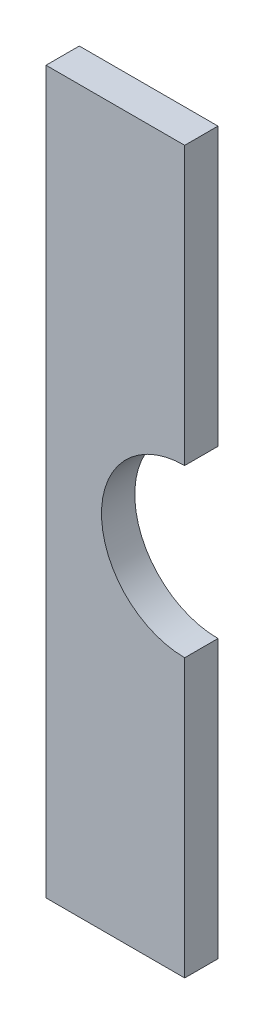
ISO-10303-21;
HEADER;
FILE_DESCRIPTION(('STEP AP214'),'2;1');
FILE_NAME('part.step','',(''),(''),'','','');
FILE_SCHEMA(('AUTOMOTIVE_DESIGN { 1 0 10303 214 1 1 1 1 }'));
ENDSEC;
DATA;
#1=APPLICATION_CONTEXT('core data for automotive mechanical design processes');
#2=APPLICATION_PROTOCOL_DEFINITION('international standard','automotive_design',2000,#1);
#3=PRODUCT_CONTEXT('',#1,'mechanical');
#4=PRODUCT('Part','Part','',(#3));
#5=PRODUCT_RELATED_PRODUCT_CATEGORY('part','',(#4));
#6=PRODUCT_DEFINITION_FORMATION('','',#4);
#7=PRODUCT_DEFINITION_CONTEXT('part definition',#1,'design');
#8=PRODUCT_DEFINITION('design','',#6,#7);
#9=PRODUCT_DEFINITION_SHAPE('','',#8);
#10=(LENGTH_UNIT() NAMED_UNIT(*) SI_UNIT(.MILLI.,.METRE.));
#11=(NAMED_UNIT(*) PLANE_ANGLE_UNIT() SI_UNIT($,.RADIAN.));
#12=(NAMED_UNIT(*) SI_UNIT($,.STERADIAN.) SOLID_ANGLE_UNIT());
#13=UNCERTAINTY_MEASURE_WITH_UNIT(LENGTH_MEASURE(1.E-05),#10,'distance_accuracy_value','');
#14=(GEOMETRIC_REPRESENTATION_CONTEXT(3) GLOBAL_UNCERTAINTY_ASSIGNED_CONTEXT((#13)) GLOBAL_UNIT_ASSIGNED_CONTEXT((#10,
#11,#12)) REPRESENTATION_CONTEXT('',''));
#15=CARTESIAN_POINT('',(0.,0.,0.));
#16=DIRECTION('',(0.,0.,1.));
#17=DIRECTION('',(1.,0.,0.));
#18=AXIS2_PLACEMENT_3D('',#15,#16,#17);
#19=CARTESIAN_POINT('',(1.75,0.,0.));
#20=DIRECTION('',(0.,0.,1.));
#21=DIRECTION('',(-1.,0.,0.));
#22=AXIS2_PLACEMENT_3D('',#19,#20,#21);
#23=CYLINDRICAL_SURFACE('',#22,0.15);
#24=CARTESIAN_POINT('',(1.75,0.,0.06));
#25=DIRECTION('',(0.,0.,-1.));
#26=DIRECTION('',(-1.,0.,0.));
#27=AXIS2_PLACEMENT_3D('',#24,#25,#26);
#28=CIRCLE('',#27,0.15);
#29=CARTESIAN_POINT('',(1.75,-0.15,0.06));
#30=VERTEX_POINT('',#29);
#31=CARTESIAN_POINT('',(1.75,0.15,0.06));
#32=VERTEX_POINT('',#31);
#33=EDGE_CURVE('E11',#30,#32,#28,.T.);
#34=ORIENTED_EDGE('',*,*,#33,.T.);
#35=DIRECTION('',(0.,0.,1.));
#36=VECTOR('',#35,1.);
#37=CARTESIAN_POINT('',(1.75,0.15,0.));
#38=LINE('',#37,#36);
#39=CARTESIAN_POINT('',(1.75,0.15,0.12));
#40=VERTEX_POINT('',#39);
#41=EDGE_CURVE('E24',#32,#40,#38,.T.);
#42=ORIENTED_EDGE('',*,*,#41,.T.);
#43=CARTESIAN_POINT('',(1.75,0.,0.12));
#44=DIRECTION('',(0.,0.,-1.));
#45=DIRECTION('',(-1.,0.,0.));
#46=AXIS2_PLACEMENT_3D('',#43,#44,#45);
#47=CIRCLE('',#46,0.15);
#48=CARTESIAN_POINT('',(1.75,-0.15,0.12));
#49=VERTEX_POINT('',#48);
#50=EDGE_CURVE('E89',#49,#40,#47,.T.);
#51=ORIENTED_EDGE('',*,*,#50,.F.);
#52=DIRECTION('',(0.,0.,1.));
#53=VECTOR('',#52,1.);
#54=CARTESIAN_POINT('',(1.75,-0.15,0.));
#55=LINE('',#54,#53);
#56=EDGE_CURVE('E36',#30,#49,#55,.T.);
#57=ORIENTED_EDGE('',*,*,#56,.F.);
#58=EDGE_LOOP('',(#34,#42,#51,#57));
#59=FACE_BOUND('',#58,.T.);
#60=ADVANCED_FACE('F17',(#59),#23,.F.);
#61=CARTESIAN_POINT('',(1.75,-0.65,0.));
#62=DIRECTION('',(1.,0.,0.));
#63=DIRECTION('',(0.,1.,0.));
#64=AXIS2_PLACEMENT_3D('',#61,#62,#63);
#65=PLANE('',#64);
#66=DIRECTION('',(0.,1.,0.));
#67=VECTOR('',#66,1.);
#68=CARTESIAN_POINT('',(1.75,-0.325,0.06));
#69=LINE('',#68,#67);
#70=CARTESIAN_POINT('',(1.75,-0.65,0.06));
#71=VERTEX_POINT('',#70);
#72=EDGE_CURVE('E114',#71,#30,#69,.T.);
#73=ORIENTED_EDGE('',*,*,#72,.T.);
#74=ORIENTED_EDGE('',*,*,#56,.T.);
#75=DIRECTION('',(0.,1.,0.));
#76=VECTOR('',#75,1.);
#77=CARTESIAN_POINT('',(1.75,-0.65,0.12));
#78=LINE('',#77,#76);
#79=CARTESIAN_POINT('',(1.75,-0.65,0.12));
#80=VERTEX_POINT('',#79);
#81=EDGE_CURVE('E112',#80,#49,#78,.T.);
#82=ORIENTED_EDGE('',*,*,#81,.F.);
#83=DIRECTION('',(0.,0.,1.));
#84=VECTOR('',#83,1.);
#85=CARTESIAN_POINT('',(1.75,-0.65,0.));
#86=LINE('',#85,#84);
#87=EDGE_CURVE('E109',#71,#80,#86,.T.);
#88=ORIENTED_EDGE('',*,*,#87,.F.);
#89=EDGE_LOOP('',(#73,#74,#82,#88));
#90=FACE_BOUND('',#89,.T.);
#91=ADVANCED_FACE('F127',(#90),#65,.T.);
#92=CARTESIAN_POINT('',(1.5,-0.65,0.));
#93=DIRECTION('',(0.,-1.,0.));
#94=DIRECTION('',(1.,0.,0.));
#95=AXIS2_PLACEMENT_3D('',#92,#93,#94);
#96=PLANE('',#95);
#97=DIRECTION('',(1.,0.,0.));
#98=VECTOR('',#97,1.);
#99=CARTESIAN_POINT('',(1.5625,-0.65,0.06));
#100=LINE('',#99,#98);
#101=CARTESIAN_POINT('',(1.5,-0.65,0.06));
#102=VERTEX_POINT('',#101);
#103=EDGE_CURVE('E106',#102,#71,#100,.T.);
#104=ORIENTED_EDGE('',*,*,#103,.T.);
#105=ORIENTED_EDGE('',*,*,#87,.T.);
#106=DIRECTION('',(1.,0.,0.));
#107=VECTOR('',#106,1.);
#108=CARTESIAN_POINT('',(-1.75,-0.65,0.12));
#109=LINE('',#108,#107);
#110=CARTESIAN_POINT('',(1.5,-0.65,0.12));
#111=VERTEX_POINT('',#110);
#112=EDGE_CURVE('E103',#111,#80,#109,.T.);
#113=ORIENTED_EDGE('',*,*,#112,.F.);
#114=DIRECTION('',(0.,0.,1.));
#115=VECTOR('',#114,1.);
#116=CARTESIAN_POINT('',(1.5,-0.65,0.));
#117=LINE('',#116,#115);
#118=EDGE_CURVE('E100',#102,#111,#117,.T.);
#119=ORIENTED_EDGE('',*,*,#118,.F.);
#120=EDGE_LOOP('',(#104,#105,#113,#119));
#121=FACE_BOUND('',#120,.T.);
#122=ADVANCED_FACE('F124',(#121),#96,.T.);
#123=CARTESIAN_POINT('',(1.5,0.65,0.));
#124=DIRECTION('',(-1.,0.,0.));
#125=DIRECTION('',(0.,-1.,0.));
#126=AXIS2_PLACEMENT_3D('',#123,#124,#125);
#127=PLANE('',#126);
#128=DIRECTION('',(0.,-1.,0.));
#129=VECTOR('',#128,1.);
#130=CARTESIAN_POINT('',(1.5,0.325,0.06));
#131=LINE('',#130,#129);
#132=CARTESIAN_POINT('',(1.5,0.65,0.06));
#133=VERTEX_POINT('',#132);
#134=EDGE_CURVE('E97',#133,#102,#131,.T.);
#135=ORIENTED_EDGE('',*,*,#134,.T.);
#136=ORIENTED_EDGE('',*,*,#118,.T.);
#137=DIRECTION('',(0.,-1.,0.));
#138=VECTOR('',#137,1.);
#139=CARTESIAN_POINT('',(1.5,0.65,0.12));
#140=LINE('',#139,#138);
#141=CARTESIAN_POINT('',(1.5,0.65,0.12));
#142=VERTEX_POINT('',#141);
#143=EDGE_CURVE('E95',#142,#111,#140,.T.);
#144=ORIENTED_EDGE('',*,*,#143,.F.);
#145=DIRECTION('',(0.,0.,1.));
#146=VECTOR('',#145,1.);
#147=CARTESIAN_POINT('',(1.5,0.65,0.));
#148=LINE('',#147,#146);
#149=EDGE_CURVE('E76',#133,#142,#148,.T.);
#150=ORIENTED_EDGE('',*,*,#149,.F.);
#151=EDGE_LOOP('',(#135,#136,#144,#150));
#152=FACE_BOUND('',#151,.T.);
#153=ADVANCED_FACE('F122',(#152),#127,.T.);
#154=CARTESIAN_POINT('',(1.75,0.65,0.));
#155=DIRECTION('',(0.,1.,0.));
#156=DIRECTION('',(-1.,0.,0.));
#157=AXIS2_PLACEMENT_3D('',#154,#155,#156);
#158=PLANE('',#157);
#159=DIRECTION('',(-1.,0.,0.));
#160=VECTOR('',#159,1.);
#161=CARTESIAN_POINT('',(1.6875,0.65,0.06));
#162=LINE('',#161,#160);
#163=CARTESIAN_POINT('',(1.75,0.65,0.06));
#164=VERTEX_POINT('',#163);
#165=EDGE_CURVE('E80',#164,#133,#162,.T.);
#166=ORIENTED_EDGE('',*,*,#165,.T.);
#167=ORIENTED_EDGE('',*,*,#149,.T.);
#168=DIRECTION('',(-1.,0.,0.));
#169=VECTOR('',#168,1.);
#170=CARTESIAN_POINT('',(1.75,0.65,0.12));
#171=LINE('',#170,#169);
#172=CARTESIAN_POINT('',(1.75,0.65,0.12));
#173=VERTEX_POINT('',#172);
#174=EDGE_CURVE('E70',#173,#142,#171,.T.);
#175=ORIENTED_EDGE('',*,*,#174,.F.);
#176=DIRECTION('',(0.,0.,1.));
#177=VECTOR('',#176,1.);
#178=CARTESIAN_POINT('',(1.75,0.65,0.));
#179=LINE('',#178,#177);
#180=EDGE_CURVE('E74',#164,#173,#179,.T.);
#181=ORIENTED_EDGE('',*,*,#180,.F.);
#182=EDGE_LOOP('',(#166,#167,#175,#181));
#183=FACE_BOUND('',#182,.T.);
#184=ADVANCED_FACE('F73',(#183),#158,.T.);
#185=CARTESIAN_POINT('',(1.75,0.15,0.));
#186=DIRECTION('',(1.,0.,0.));
#187=DIRECTION('',(0.,1.,0.));
#188=AXIS2_PLACEMENT_3D('',#185,#186,#187);
#189=PLANE('',#188);
#190=DIRECTION('',(0.,1.,0.));
#191=VECTOR('',#190,1.);
#192=CARTESIAN_POINT('',(1.75,0.075,0.06));
#193=LINE('',#192,#191);
#194=EDGE_CURVE('E85',#32,#164,#193,.T.);
#195=ORIENTED_EDGE('',*,*,#194,.T.);
#196=ORIENTED_EDGE('',*,*,#180,.T.);
#197=DIRECTION('',(0.,1.,0.));
#198=VECTOR('',#197,1.);
#199=CARTESIAN_POINT('',(1.75,-0.65,0.12));
#200=LINE('',#199,#198);
#201=EDGE_CURVE('E83',#40,#173,#200,.T.);
#202=ORIENTED_EDGE('',*,*,#201,.F.);
#203=ORIENTED_EDGE('',*,*,#41,.F.);
#204=EDGE_LOOP('',(#195,#196,#202,#203));
#205=FACE_BOUND('',#204,.T.);
#206=ADVANCED_FACE('F82',(#205),#189,.T.);
#207=CARTESIAN_POINT('',(1.625,0.,0.12));
#208=DIRECTION('',(0.,0.,1.));
#209=DIRECTION('',(1.,0.,0.));
#210=AXIS2_PLACEMENT_3D('',#207,#208,#209);
#211=PLANE('',#210);
#212=ORIENTED_EDGE('',*,*,#201,.T.);
#213=ORIENTED_EDGE('',*,*,#174,.T.);
#214=ORIENTED_EDGE('',*,*,#143,.T.);
#215=ORIENTED_EDGE('',*,*,#112,.T.);
#216=ORIENTED_EDGE('',*,*,#81,.T.);
#217=ORIENTED_EDGE('',*,*,#50,.T.);
#218=EDGE_LOOP('',(#212,#213,#214,#215,#216,#217));
#219=FACE_BOUND('',#218,.T.);
#220=ADVANCED_FACE('F87',(#219),#211,.T.);
#221=CARTESIAN_POINT('',(1.625,0.,0.06));
#222=DIRECTION('',(0.,0.,1.));
#223=DIRECTION('',(1.,0.,0.));
#224=AXIS2_PLACEMENT_3D('',#221,#222,#223);
#225=PLANE('',#224);
#226=ORIENTED_EDGE('',*,*,#194,.F.);
#227=ORIENTED_EDGE('',*,*,#33,.F.);
#228=ORIENTED_EDGE('',*,*,#72,.F.);
#229=ORIENTED_EDGE('',*,*,#103,.F.);
#230=ORIENTED_EDGE('',*,*,#134,.F.);
#231=ORIENTED_EDGE('',*,*,#165,.F.);
#232=EDGE_LOOP('',(#226,#227,#228,#229,#230,#231));
#233=FACE_BOUND('',#232,.T.);
#234=ADVANCED_FACE('F119',(#233),#225,.F.);
#235=CLOSED_SHELL('',(#60,#91,#122,#153,#184,#206,#220,#234));
#236=MANIFOLD_SOLID_BREP('B1',#235);
#237=ADVANCED_BREP_SHAPE_REPRESENTATION('',(#18,#236),#14);
#238=SHAPE_DEFINITION_REPRESENTATION(#9,#237);
ENDSEC;
END-ISO-10303-21;
